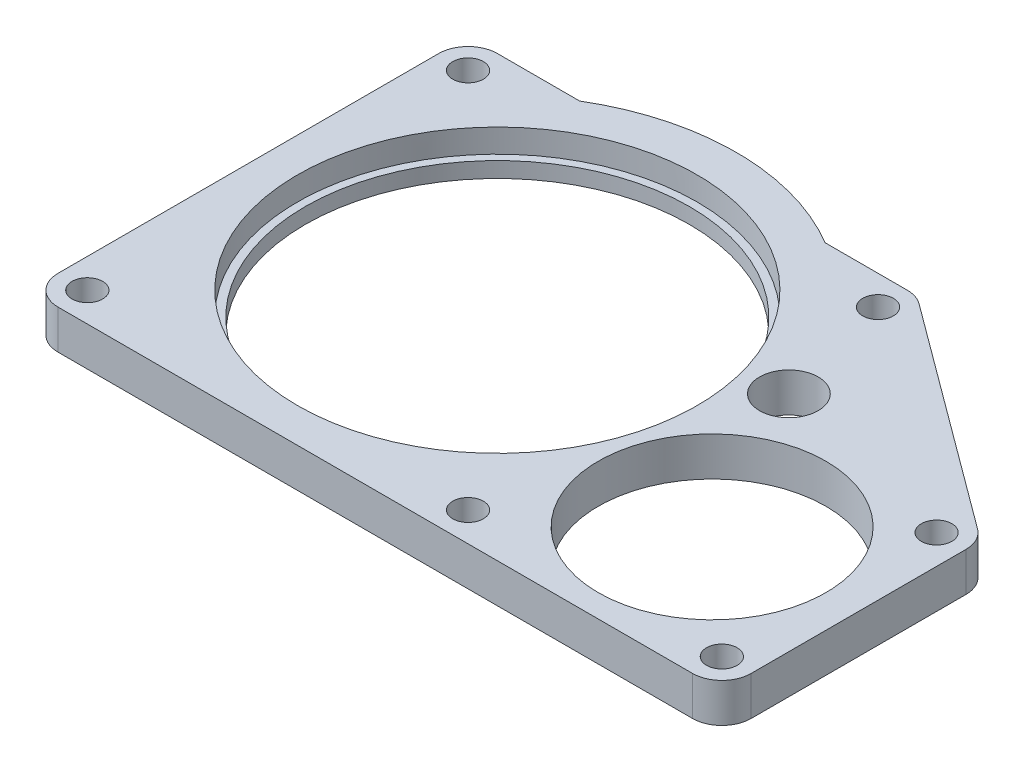
ISO-10303-21;
HEADER;
FILE_DESCRIPTION(('STEP AP214'),'2;1');
FILE_NAME('part.step','',(''),(''),'','','');
FILE_SCHEMA(('AUTOMOTIVE_DESIGN { 1 0 10303 214 1 1 1 1 }'));
ENDSEC;
DATA;
#1=APPLICATION_CONTEXT('core data for automotive mechanical design processes');
#2=APPLICATION_PROTOCOL_DEFINITION('international standard','automotive_design',2000,#1);
#3=PRODUCT_CONTEXT('',#1,'mechanical');
#4=PRODUCT('Part','Part','',(#3));
#5=PRODUCT_RELATED_PRODUCT_CATEGORY('part','',(#4));
#6=PRODUCT_DEFINITION_FORMATION('','',#4);
#7=PRODUCT_DEFINITION_CONTEXT('part definition',#1,'design');
#8=PRODUCT_DEFINITION('design','',#6,#7);
#9=PRODUCT_DEFINITION_SHAPE('','',#8);
#10=(LENGTH_UNIT() NAMED_UNIT(*) SI_UNIT(.MILLI.,.METRE.));
#11=(NAMED_UNIT(*) PLANE_ANGLE_UNIT() SI_UNIT($,.RADIAN.));
#12=(NAMED_UNIT(*) SI_UNIT($,.STERADIAN.) SOLID_ANGLE_UNIT());
#13=UNCERTAINTY_MEASURE_WITH_UNIT(LENGTH_MEASURE(1.E-05),#10,'distance_accuracy_value','');
#14=(GEOMETRIC_REPRESENTATION_CONTEXT(3) GLOBAL_UNCERTAINTY_ASSIGNED_CONTEXT((#13)) GLOBAL_UNIT_ASSIGNED_CONTEXT((#10,
#11,#12)) REPRESENTATION_CONTEXT('',''));
#15=CARTESIAN_POINT('',(0.,0.,0.));
#16=DIRECTION('',(0.,0.,1.));
#17=DIRECTION('',(1.,0.,0.));
#18=AXIS2_PLACEMENT_3D('',#15,#16,#17);
#19=CARTESIAN_POINT('',(0.,21.575,0.));
#20=DIRECTION('',(0.,1.,0.));
#21=DIRECTION('',(0.,0.,1.));
#22=AXIS2_PLACEMENT_3D('',#19,#20,#21);
#23=CYLINDRICAL_SURFACE('',#22,32.5);
#24=CARTESIAN_POINT('',(0.,27.925,0.));
#25=DIRECTION('',(0.,1.,0.));
#26=DIRECTION('',(0.,0.,1.));
#27=AXIS2_PLACEMENT_3D('',#24,#25,#26);
#28=CIRCLE('',#27,32.5);
#29=CARTESIAN_POINT('',(0.,27.925,32.5));
#30=VERTEX_POINT('',#29);
#31=EDGE_CURVE('E161',#30,#30,#28,.T.);
#32=ORIENTED_EDGE('',*,*,#31,.T.);
#33=EDGE_LOOP('',(#32));
#34=FACE_BOUND('',#33,.T.);
#35=CARTESIAN_POINT('',(0.,24.1,0.));
#36=DIRECTION('',(0.,-1.,0.));
#37=DIRECTION('',(0.,0.,-1.));
#38=AXIS2_PLACEMENT_3D('',#35,#36,#37);
#39=CIRCLE('',#38,32.5);
#40=CARTESIAN_POINT('',(0.,24.1,-32.5));
#41=VERTEX_POINT('',#40);
#42=EDGE_CURVE('E11',#41,#41,#39,.F.);
#43=ORIENTED_EDGE('',*,*,#42,.F.);
#44=EDGE_LOOP('',(#43));
#45=FACE_BOUND('',#44,.T.);
#46=ADVANCED_FACE('F33',(#34,#45),#23,.F.);
#47=CARTESIAN_POINT('',(-33.3375,21.575,33.3375));
#48=DIRECTION('',(0.,1.,0.));
#49=DIRECTION('',(0.,0.,1.));
#50=AXIS2_PLACEMENT_3D('',#47,#48,#49);
#51=CYLINDRICAL_SURFACE('',#50,4.76250000000001);
#52=CARTESIAN_POINT('',(-33.3375,27.925,33.3375));
#53=DIRECTION('',(0.,1.,0.));
#54=DIRECTION('',(0.,0.,1.));
#55=AXIS2_PLACEMENT_3D('',#52,#53,#54);
#56=CIRCLE('',#55,4.76250000000001);
#57=CARTESIAN_POINT('',(-38.1,27.925,33.3375));
#58=VERTEX_POINT('',#57);
#59=CARTESIAN_POINT('',(-33.3375,27.925,38.1));
#60=VERTEX_POINT('',#59);
#61=EDGE_CURVE('E157',#58,#60,#56,.T.);
#62=ORIENTED_EDGE('',*,*,#61,.F.);
#63=DIRECTION('',(0.,1.,0.));
#64=VECTOR('',#63,1.);
#65=CARTESIAN_POINT('',(-38.1,21.575,33.3375));
#66=LINE('',#65,#64);
#67=CARTESIAN_POINT('',(-38.1,21.575,33.3375));
#68=VERTEX_POINT('',#67);
#69=EDGE_CURVE('E42',#68,#58,#66,.T.);
#70=ORIENTED_EDGE('',*,*,#69,.F.);
#71=CARTESIAN_POINT('',(-33.3375,21.575,33.3375));
#72=DIRECTION('',(0.,1.,0.));
#73=DIRECTION('',(0.,0.,1.));
#74=AXIS2_PLACEMENT_3D('',#71,#72,#73);
#75=CIRCLE('',#74,4.76250000000001);
#76=CARTESIAN_POINT('',(-33.3375,21.575,38.1));
#77=VERTEX_POINT('',#76);
#78=EDGE_CURVE('E191',#68,#77,#75,.T.);
#79=ORIENTED_EDGE('',*,*,#78,.T.);
#80=DIRECTION('',(0.,1.,0.));
#81=VECTOR('',#80,1.);
#82=CARTESIAN_POINT('',(-33.3375,21.575,38.1));
#83=LINE('',#82,#81);
#84=EDGE_CURVE('E102',#77,#60,#83,.T.);
#85=ORIENTED_EDGE('',*,*,#84,.T.);
#86=EDGE_LOOP('',(#62,#70,#79,#85));
#87=FACE_BOUND('',#86,.T.);
#88=ADVANCED_FACE('F35',(#87),#51,.T.);
#89=CARTESIAN_POINT('',(-38.1,21.575,-28.575));
#90=DIRECTION('',(-1.,0.,0.));
#91=DIRECTION('',(0.,0.,1.));
#92=AXIS2_PLACEMENT_3D('',#89,#90,#91);
#93=PLANE('',#92);
#94=DIRECTION('',(0.,0.,1.));
#95=VECTOR('',#94,1.);
#96=CARTESIAN_POINT('',(-38.1,27.925,-28.575));
#97=LINE('',#96,#95);
#98=CARTESIAN_POINT('',(-38.1,27.925,-28.575));
#99=VERTEX_POINT('',#98);
#100=EDGE_CURVE('E188',#99,#58,#97,.T.);
#101=ORIENTED_EDGE('',*,*,#100,.F.);
#102=DIRECTION('',(0.,1.,0.));
#103=VECTOR('',#102,1.);
#104=CARTESIAN_POINT('',(-38.1,21.575,-28.575));
#105=LINE('',#104,#103);
#106=CARTESIAN_POINT('',(-38.1,21.575,-28.575));
#107=VERTEX_POINT('',#106);
#108=EDGE_CURVE('E90',#107,#99,#105,.T.);
#109=ORIENTED_EDGE('',*,*,#108,.F.);
#110=DIRECTION('',(0.,0.,1.));
#111=VECTOR('',#110,1.);
#112=CARTESIAN_POINT('',(-38.1,21.575,-28.575));
#113=LINE('',#112,#111);
#114=EDGE_CURVE('E147',#107,#68,#113,.T.);
#115=ORIENTED_EDGE('',*,*,#114,.T.);
#116=ORIENTED_EDGE('',*,*,#69,.T.);
#117=EDGE_LOOP('',(#101,#109,#115,#116));
#118=FACE_BOUND('',#117,.T.);
#119=ADVANCED_FACE('F212',(#118),#93,.T.);
#120=CARTESIAN_POINT('',(-33.3375,21.575,-28.575));
#121=DIRECTION('',(0.,1.,0.));
#122=DIRECTION('',(0.,0.,1.));
#123=AXIS2_PLACEMENT_3D('',#120,#121,#122);
#124=CYLINDRICAL_SURFACE('',#123,4.76250000000003);
#125=CARTESIAN_POINT('',(-33.3375,27.925,-28.575));
#126=DIRECTION('',(0.,1.,0.));
#127=DIRECTION('',(0.,0.,-1.));
#128=AXIS2_PLACEMENT_3D('',#125,#126,#127);
#129=CIRCLE('',#128,4.76250000000003);
#130=CARTESIAN_POINT('',(-33.3375,27.925,-33.3375));
#131=VERTEX_POINT('',#130);
#132=EDGE_CURVE('E133',#131,#99,#129,.T.);
#133=ORIENTED_EDGE('',*,*,#132,.F.);
#134=DIRECTION('',(0.,1.,0.));
#135=VECTOR('',#134,1.);
#136=CARTESIAN_POINT('',(-33.3375,21.575,-33.3375));
#137=LINE('',#136,#135);
#138=CARTESIAN_POINT('',(-33.3375,21.575,-33.3375));
#139=VERTEX_POINT('',#138);
#140=EDGE_CURVE('E128',#139,#131,#137,.T.);
#141=ORIENTED_EDGE('',*,*,#140,.F.);
#142=CARTESIAN_POINT('',(-33.3375,21.575,-28.575));
#143=DIRECTION('',(0.,1.,0.));
#144=DIRECTION('',(0.,0.,-1.));
#145=AXIS2_PLACEMENT_3D('',#142,#143,#144);
#146=CIRCLE('',#145,4.76250000000003);
#147=EDGE_CURVE('E131',#139,#107,#146,.T.);
#148=ORIENTED_EDGE('',*,*,#147,.T.);
#149=ORIENTED_EDGE('',*,*,#108,.T.);
#150=EDGE_LOOP('',(#133,#141,#148,#149));
#151=FACE_BOUND('',#150,.T.);
#152=ADVANCED_FACE('F130',(#151),#124,.T.);
#153=CARTESIAN_POINT('',(-33.3375,21.575,-33.3375));
#154=DIRECTION('',(0.,0.,-1.));
#155=DIRECTION('',(-1.,0.,0.));
#156=AXIS2_PLACEMENT_3D('',#153,#154,#155);
#157=PLANE('',#156);
#158=DIRECTION('',(-1.,0.,0.));
#159=VECTOR('',#158,1.);
#160=CARTESIAN_POINT('',(-33.3375,27.925,-33.3375));
#161=LINE('',#160,#159);
#162=CARTESIAN_POINT('',(-19.9482729515615,27.925,-33.3375));
#163=VERTEX_POINT('',#162);
#164=EDGE_CURVE('E185',#163,#131,#161,.T.);
#165=ORIENTED_EDGE('',*,*,#164,.F.);
#166=DIRECTION('',(0.,1.,0.));
#167=VECTOR('',#166,1.);
#168=CARTESIAN_POINT('',(-19.9482729515615,21.575,-33.3375));
#169=LINE('',#168,#167);
#170=CARTESIAN_POINT('',(-19.9482729515615,21.575,-33.3375));
#171=VERTEX_POINT('',#170);
#172=EDGE_CURVE('E138',#171,#163,#169,.T.);
#173=ORIENTED_EDGE('',*,*,#172,.F.);
#174=DIRECTION('',(-1.,0.,0.));
#175=VECTOR('',#174,1.);
#176=CARTESIAN_POINT('',(-33.3375,21.575,-33.3375));
#177=LINE('',#176,#175);
#178=EDGE_CURVE('E145',#171,#139,#177,.T.);
#179=ORIENTED_EDGE('',*,*,#178,.T.);
#180=ORIENTED_EDGE('',*,*,#140,.T.);
#181=EDGE_LOOP('',(#165,#173,#179,#180));
#182=FACE_BOUND('',#181,.T.);
#183=ADVANCED_FACE('F149',(#182),#157,.T.);
#184=CARTESIAN_POINT('',(0.,21.575,0.));
#185=DIRECTION('',(0.,1.,0.));
#186=DIRECTION('',(0.,0.,1.));
#187=AXIS2_PLACEMENT_3D('',#184,#185,#186);
#188=CYLINDRICAL_SURFACE('',#187,38.85);
#189=CARTESIAN_POINT('',(0.,27.925,0.));
#190=DIRECTION('',(0.,1.,0.));
#191=DIRECTION('',(0.,0.,-1.));
#192=AXIS2_PLACEMENT_3D('',#189,#190,#191);
#193=CIRCLE('',#192,38.85);
#194=CARTESIAN_POINT('',(19.9482729515615,27.925,-33.3375));
#195=VERTEX_POINT('',#194);
#196=EDGE_CURVE('E182',#195,#163,#193,.T.);
#197=ORIENTED_EDGE('',*,*,#196,.F.);
#198=DIRECTION('',(0.,1.,0.));
#199=VECTOR('',#198,1.);
#200=CARTESIAN_POINT('',(19.9482729515615,21.575,-33.3375));
#201=LINE('',#200,#199);
#202=CARTESIAN_POINT('',(19.9482729515615,21.575,-33.3375));
#203=VERTEX_POINT('',#202);
#204=EDGE_CURVE('E195',#203,#195,#201,.T.);
#205=ORIENTED_EDGE('',*,*,#204,.F.);
#206=CARTESIAN_POINT('',(0.,21.575,0.));
#207=DIRECTION('',(0.,1.,0.));
#208=DIRECTION('',(0.,0.,-1.));
#209=AXIS2_PLACEMENT_3D('',#206,#207,#208);
#210=CIRCLE('',#209,38.85);
#211=EDGE_CURVE('E150',#203,#171,#210,.T.);
#212=ORIENTED_EDGE('',*,*,#211,.T.);
#213=ORIENTED_EDGE('',*,*,#172,.T.);
#214=EDGE_LOOP('',(#197,#205,#212,#213));
#215=FACE_BOUND('',#214,.T.);
#216=ADVANCED_FACE('F323',(#215),#188,.T.);
#217=CARTESIAN_POINT('',(19.9482729515615,21.575,-33.3375));
#218=DIRECTION('',(0.,0.,-1.));
#219=DIRECTION('',(-1.,0.,0.));
#220=AXIS2_PLACEMENT_3D('',#217,#218,#219);
#221=PLANE('',#220);
#222=DIRECTION('',(-1.,0.,0.));
#223=VECTOR('',#222,1.);
#224=CARTESIAN_POINT('',(19.9482729515615,27.925,-33.3375));
#225=LINE('',#224,#223);
#226=CARTESIAN_POINT('',(33.3375,27.925,-33.3375));
#227=VERTEX_POINT('',#226);
#228=EDGE_CURVE('E179',#227,#195,#225,.T.);
#229=ORIENTED_EDGE('',*,*,#228,.F.);
#230=DIRECTION('',(0.,1.,0.));
#231=VECTOR('',#230,1.);
#232=CARTESIAN_POINT('',(33.3375,21.575,-33.3375));
#233=LINE('',#232,#231);
#234=CARTESIAN_POINT('',(33.3375,21.575,-33.3375));
#235=VERTEX_POINT('',#234);
#236=EDGE_CURVE('E197',#235,#227,#233,.T.);
#237=ORIENTED_EDGE('',*,*,#236,.F.);
#238=DIRECTION('',(-1.,0.,0.));
#239=VECTOR('',#238,1.);
#240=CARTESIAN_POINT('',(19.9482729515615,21.575,-33.3375));
#241=LINE('',#240,#239);
#242=EDGE_CURVE('E152',#235,#203,#241,.T.);
#243=ORIENTED_EDGE('',*,*,#242,.T.);
#244=ORIENTED_EDGE('',*,*,#204,.T.);
#245=EDGE_LOOP('',(#229,#237,#243,#244));
#246=FACE_BOUND('',#245,.T.);
#247=ADVANCED_FACE('F301',(#246),#221,.T.);
#248=CARTESIAN_POINT('',(33.3375,21.575,-28.575));
#249=DIRECTION('',(0.,1.,0.));
#250=DIRECTION('',(0.,0.,1.));
#251=AXIS2_PLACEMENT_3D('',#248,#249,#250);
#252=CYLINDRICAL_SURFACE('',#251,4.7625);
#253=CARTESIAN_POINT('',(33.3375,27.925,-28.575));
#254=DIRECTION('',(0.,1.,0.));
#255=DIRECTION('',(0.,0.,-1.));
#256=AXIS2_PLACEMENT_3D('',#253,#254,#255);
#257=CIRCLE('',#256,4.7625);
#258=CARTESIAN_POINT('',(36.1682874284116,27.925,-32.4048888737334));
#259=VERTEX_POINT('',#258);
#260=EDGE_CURVE('E176',#259,#227,#257,.T.);
#261=ORIENTED_EDGE('',*,*,#260,.F.);
#262=DIRECTION('',(0.,1.,0.));
#263=VECTOR('',#262,1.);
#264=CARTESIAN_POINT('',(36.1682874284116,21.575,-32.4048888737334));
#265=LINE('',#264,#263);
#266=CARTESIAN_POINT('',(36.1682874284116,21.575,-32.4048888737334));
#267=VERTEX_POINT('',#266);
#268=EDGE_CURVE('E199',#267,#259,#265,.T.);
#269=ORIENTED_EDGE('',*,*,#268,.F.);
#270=CARTESIAN_POINT('',(33.3375,21.575,-28.575));
#271=DIRECTION('',(0.,1.,0.));
#272=DIRECTION('',(0.,0.,-1.));
#273=AXIS2_PLACEMENT_3D('',#270,#271,#272);
#274=CIRCLE('',#273,4.7625);
#275=EDGE_CURVE('E295',#267,#235,#274,.T.);
#276=ORIENTED_EDGE('',*,*,#275,.T.);
#277=ORIENTED_EDGE('',*,*,#236,.T.);
#278=EDGE_LOOP('',(#261,#269,#276,#277));
#279=FACE_BOUND('',#278,.T.);
#280=ADVANCED_FACE('F307',(#279),#252,.T.);
#281=CARTESIAN_POINT('',(36.1682874284116,21.575,-32.4048888737334));
#282=DIRECTION('',(0.594391061083806,0.,-0.804176141466325));
#283=DIRECTION('',(-0.804176141466325,0.,-0.594391061083806));
#284=AXIS2_PLACEMENT_3D('',#281,#282,#283);
#285=PLANE('',#284);
#286=DIRECTION('',(-0.804176141466325,0.,-0.594391061083806));
#287=VECTOR('',#286,1.);
#288=CARTESIAN_POINT('',(36.1682874284116,27.925,-32.4048888737334));
#289=LINE('',#288,#287);
#290=CARTESIAN_POINT('',(72.6807874284116,27.925,-5.41738887373337));
#291=VERTEX_POINT('',#290);
#292=EDGE_CURVE('E173',#291,#259,#289,.T.);
#293=ORIENTED_EDGE('',*,*,#292,.F.);
#294=DIRECTION('',(0.,1.,0.));
#295=VECTOR('',#294,1.);
#296=CARTESIAN_POINT('',(72.6807874284116,21.575,-5.41738887373337));
#297=LINE('',#296,#295);
#298=CARTESIAN_POINT('',(72.6807874284116,21.575,-5.41738887373337));
#299=VERTEX_POINT('',#298);
#300=EDGE_CURVE('E201',#299,#291,#297,.T.);
#301=ORIENTED_EDGE('',*,*,#300,.F.);
#302=DIRECTION('',(-0.804176141466325,0.,-0.594391061083806));
#303=VECTOR('',#302,1.);
#304=CARTESIAN_POINT('',(36.1682874284116,21.575,-32.4048888737334));
#305=LINE('',#304,#303);
#306=EDGE_CURVE('E292',#299,#267,#305,.T.);
#307=ORIENTED_EDGE('',*,*,#306,.T.);
#308=ORIENTED_EDGE('',*,*,#268,.T.);
#309=EDGE_LOOP('',(#293,#301,#307,#308));
#310=FACE_BOUND('',#309,.T.);
#311=ADVANCED_FACE('F310',(#310),#285,.T.);
#312=CARTESIAN_POINT('',(69.85,21.575,-1.5875));
#313=DIRECTION('',(0.,1.,0.));
#314=DIRECTION('',(0.,0.,1.));
#315=AXIS2_PLACEMENT_3D('',#312,#313,#314);
#316=CYLINDRICAL_SURFACE('',#315,4.7625);
#317=CARTESIAN_POINT('',(69.85,27.925,-1.5875));
#318=DIRECTION('',(0.,1.,0.));
#319=DIRECTION('',(0.,0.,1.));
#320=AXIS2_PLACEMENT_3D('',#317,#318,#319);
#321=CIRCLE('',#320,4.7625);
#322=CARTESIAN_POINT('',(74.6125,27.925,-1.5875));
#323=VERTEX_POINT('',#322);
#324=EDGE_CURVE('E170',#323,#291,#321,.T.);
#325=ORIENTED_EDGE('',*,*,#324,.F.);
#326=DIRECTION('',(0.,1.,0.));
#327=VECTOR('',#326,1.);
#328=CARTESIAN_POINT('',(74.6125,21.575,-1.5875));
#329=LINE('',#328,#327);
#330=CARTESIAN_POINT('',(74.6125,21.575,-1.5875));
#331=VERTEX_POINT('',#330);
#332=EDGE_CURVE('E203',#331,#323,#329,.T.);
#333=ORIENTED_EDGE('',*,*,#332,.F.);
#334=CARTESIAN_POINT('',(69.85,21.575,-1.5875));
#335=DIRECTION('',(0.,1.,0.));
#336=DIRECTION('',(0.,0.,1.));
#337=AXIS2_PLACEMENT_3D('',#334,#335,#336);
#338=CIRCLE('',#337,4.7625);
#339=EDGE_CURVE('E289',#331,#299,#338,.T.);
#340=ORIENTED_EDGE('',*,*,#339,.T.);
#341=ORIENTED_EDGE('',*,*,#300,.T.);
#342=EDGE_LOOP('',(#325,#333,#340,#341));
#343=FACE_BOUND('',#342,.T.);
#344=ADVANCED_FACE('F315',(#343),#316,.T.);
#345=CARTESIAN_POINT('',(74.6125,21.575,-1.5875));
#346=DIRECTION('',(1.,0.,0.));
#347=DIRECTION('',(0.,0.,-1.));
#348=AXIS2_PLACEMENT_3D('',#345,#346,#347);
#349=PLANE('',#348);
#350=DIRECTION('',(0.,0.,-1.));
#351=VECTOR('',#350,1.);
#352=CARTESIAN_POINT('',(74.6125,27.925,-1.5875));
#353=LINE('',#352,#351);
#354=CARTESIAN_POINT('',(74.6125,27.925,33.3375));
#355=VERTEX_POINT('',#354);
#356=EDGE_CURVE('E167',#355,#323,#353,.T.);
#357=ORIENTED_EDGE('',*,*,#356,.F.);
#358=DIRECTION('',(0.,1.,0.));
#359=VECTOR('',#358,1.);
#360=CARTESIAN_POINT('',(74.6125,21.575,33.3375));
#361=LINE('',#360,#359);
#362=CARTESIAN_POINT('',(74.6125,21.575,33.3375));
#363=VERTEX_POINT('',#362);
#364=EDGE_CURVE('E205',#363,#355,#361,.T.);
#365=ORIENTED_EDGE('',*,*,#364,.F.);
#366=DIRECTION('',(0.,0.,-1.));
#367=VECTOR('',#366,1.);
#368=CARTESIAN_POINT('',(74.6125,21.575,-1.5875));
#369=LINE('',#368,#367);
#370=EDGE_CURVE('E286',#363,#331,#369,.T.);
#371=ORIENTED_EDGE('',*,*,#370,.T.);
#372=ORIENTED_EDGE('',*,*,#332,.T.);
#373=EDGE_LOOP('',(#357,#365,#371,#372));
#374=FACE_BOUND('',#373,.T.);
#375=ADVANCED_FACE('F318',(#374),#349,.T.);
#376=CARTESIAN_POINT('',(69.85,21.575,33.3375));
#377=DIRECTION('',(0.,1.,0.));
#378=DIRECTION('',(0.,0.,1.));
#379=AXIS2_PLACEMENT_3D('',#376,#377,#378);
#380=CYLINDRICAL_SURFACE('',#379,4.76250000000001);
#381=CARTESIAN_POINT('',(69.85,27.925,33.3375));
#382=DIRECTION('',(0.,1.,0.));
#383=DIRECTION('',(0.,0.,1.));
#384=AXIS2_PLACEMENT_3D('',#381,#382,#383);
#385=CIRCLE('',#384,4.76250000000001);
#386=CARTESIAN_POINT('',(69.85,27.925,38.1));
#387=VERTEX_POINT('',#386);
#388=EDGE_CURVE('E164',#387,#355,#385,.T.);
#389=ORIENTED_EDGE('',*,*,#388,.F.);
#390=DIRECTION('',(0.,1.,0.));
#391=VECTOR('',#390,1.);
#392=CARTESIAN_POINT('',(69.85,21.575,38.1));
#393=LINE('',#392,#391);
#394=CARTESIAN_POINT('',(69.85,21.575,38.1));
#395=VERTEX_POINT('',#394);
#396=EDGE_CURVE('E207',#395,#387,#393,.T.);
#397=ORIENTED_EDGE('',*,*,#396,.F.);
#398=CARTESIAN_POINT('',(69.85,21.575,33.3375));
#399=DIRECTION('',(0.,1.,0.));
#400=DIRECTION('',(0.,0.,1.));
#401=AXIS2_PLACEMENT_3D('',#398,#399,#400);
#402=CIRCLE('',#401,4.76250000000001);
#403=EDGE_CURVE('E283',#395,#363,#402,.T.);
#404=ORIENTED_EDGE('',*,*,#403,.T.);
#405=ORIENTED_EDGE('',*,*,#364,.T.);
#406=EDGE_LOOP('',(#389,#397,#404,#405));
#407=FACE_BOUND('',#406,.T.);
#408=ADVANCED_FACE('F321',(#407),#380,.T.);
#409=CARTESIAN_POINT('',(-33.3375,21.575,38.1));
#410=DIRECTION('',(0.,0.,1.));
#411=DIRECTION('',(1.,0.,0.));
#412=AXIS2_PLACEMENT_3D('',#409,#410,#411);
#413=PLANE('',#412);
#414=DIRECTION('',(1.,0.,0.));
#415=VECTOR('',#414,1.);
#416=CARTESIAN_POINT('',(-33.3375,27.925,38.1));
#417=LINE('',#416,#415);
#418=EDGE_CURVE('E160',#60,#387,#417,.T.);
#419=ORIENTED_EDGE('',*,*,#418,.F.);
#420=ORIENTED_EDGE('',*,*,#84,.F.);
#421=DIRECTION('',(1.,0.,0.));
#422=VECTOR('',#421,1.);
#423=CARTESIAN_POINT('',(-33.3375,21.575,38.1));
#424=LINE('',#423,#422);
#425=EDGE_CURVE('E281',#77,#395,#424,.T.);
#426=ORIENTED_EDGE('',*,*,#425,.T.);
#427=ORIENTED_EDGE('',*,*,#396,.T.);
#428=EDGE_LOOP('',(#419,#420,#426,#427));
#429=FACE_BOUND('',#428,.T.);
#430=ADVANCED_FACE('F208',(#429),#413,.T.);
#431=CARTESIAN_POINT('',(-33.3375,21.575,33.3375));
#432=DIRECTION('',(0.,1.,0.));
#433=DIRECTION('',(0.,0.,1.));
#434=AXIS2_PLACEMENT_3D('',#431,#432,#433);
#435=PLANE('',#434);
#436=CARTESIAN_POINT('',(33.3375,21.575,-28.575));
#437=DIRECTION('',(0.,1.,0.));
#438=DIRECTION('',(0.,0.,1.));
#439=AXIS2_PLACEMENT_3D('',#436,#437,#438);
#440=CIRCLE('',#439,2.4892);
#441=CARTESIAN_POINT('',(33.3375,21.575,-26.0858));
#442=VERTEX_POINT('',#441);
#443=EDGE_CURVE('E467',#442,#442,#440,.T.);
#444=ORIENTED_EDGE('',*,*,#443,.T.);
#445=EDGE_LOOP('',(#444));
#446=FACE_BOUND('',#445,.T.);
#447=CARTESIAN_POINT('',(69.85,21.575,-1.5875));
#448=DIRECTION('',(0.,1.,0.));
#449=DIRECTION('',(0.,0.,1.));
#450=AXIS2_PLACEMENT_3D('',#447,#448,#449);
#451=CIRCLE('',#450,2.4892);
#452=CARTESIAN_POINT('',(69.85,21.575,0.901700000000004));
#453=VERTEX_POINT('',#452);
#454=EDGE_CURVE('E471',#453,#453,#451,.T.);
#455=ORIENTED_EDGE('',*,*,#454,.T.);
#456=EDGE_LOOP('',(#455));
#457=FACE_BOUND('',#456,.T.);
#458=CARTESIAN_POINT('',(69.85,21.575,33.3375));
#459=DIRECTION('',(0.,1.,0.));
#460=DIRECTION('',(0.,0.,1.));
#461=AXIS2_PLACEMENT_3D('',#458,#459,#460);
#462=CIRCLE('',#461,2.4892);
#463=CARTESIAN_POINT('',(69.85,21.575,35.8267));
#464=VERTEX_POINT('',#463);
#465=EDGE_CURVE('E475',#464,#464,#462,.T.);
#466=ORIENTED_EDGE('',*,*,#465,.T.);
#467=EDGE_LOOP('',(#466));
#468=FACE_BOUND('',#467,.T.);
#469=CARTESIAN_POINT('',(38.3007293409388,21.575,-9.11323389100423));
#470=DIRECTION('',(0.,1.,0.));
#471=DIRECTION('',(0.,0.,1.));
#472=AXIS2_PLACEMENT_3D('',#469,#470,#471);
#473=CIRCLE('',#472,4.7625);
#474=CARTESIAN_POINT('',(38.3007293409388,21.575,-4.35073389100423));
#475=VERTEX_POINT('',#474);
#476=EDGE_CURVE('E479',#475,#475,#473,.T.);
#477=ORIENTED_EDGE('',*,*,#476,.T.);
#478=EDGE_LOOP('',(#477));
#479=FACE_BOUND('',#478,.T.);
#480=CARTESIAN_POINT('',(50.8,21.575,15.875));
#481=DIRECTION('',(0.,1.,0.));
#482=DIRECTION('',(0.,0.,1.));
#483=AXIS2_PLACEMENT_3D('',#480,#481,#482);
#484=CIRCLE('',#483,18.5166);
#485=CARTESIAN_POINT('',(50.8,21.575,34.3916));
#486=VERTEX_POINT('',#485);
#487=EDGE_CURVE('E483',#486,#486,#484,.T.);
#488=ORIENTED_EDGE('',*,*,#487,.T.);
#489=EDGE_LOOP('',(#488));
#490=FACE_BOUND('',#489,.T.);
#491=CARTESIAN_POINT('',(28.575,21.575,33.3375));
#492=DIRECTION('',(0.,1.,0.));
#493=DIRECTION('',(0.,0.,1.));
#494=AXIS2_PLACEMENT_3D('',#491,#492,#493);
#495=CIRCLE('',#494,2.4892);
#496=CARTESIAN_POINT('',(28.575,21.575,35.8267));
#497=VERTEX_POINT('',#496);
#498=EDGE_CURVE('E487',#497,#497,#495,.T.);
#499=ORIENTED_EDGE('',*,*,#498,.T.);
#500=EDGE_LOOP('',(#499));
#501=FACE_BOUND('',#500,.T.);
#502=CARTESIAN_POINT('',(-33.3375,21.575,33.3375));
#503=DIRECTION('',(0.,1.,0.));
#504=DIRECTION('',(0.,0.,1.));
#505=AXIS2_PLACEMENT_3D('',#502,#503,#504);
#506=CIRCLE('',#505,2.4892);
#507=CARTESIAN_POINT('',(-33.3375,21.575,35.8267));
#508=VERTEX_POINT('',#507);
#509=EDGE_CURVE('E491',#508,#508,#506,.T.);
#510=ORIENTED_EDGE('',*,*,#509,.T.);
#511=EDGE_LOOP('',(#510));
#512=FACE_BOUND('',#511,.T.);
#513=CARTESIAN_POINT('',(-33.3375,21.575,-28.575));
#514=DIRECTION('',(0.,1.,0.));
#515=DIRECTION('',(0.,0.,1.));
#516=AXIS2_PLACEMENT_3D('',#513,#514,#515);
#517=CIRCLE('',#516,2.4892);
#518=CARTESIAN_POINT('',(-33.3375,21.575,-26.0858));
#519=VERTEX_POINT('',#518);
#520=EDGE_CURVE('E274',#519,#519,#517,.T.);
#521=ORIENTED_EDGE('',*,*,#520,.T.);
#522=EDGE_LOOP('',(#521));
#523=FACE_BOUND('',#522,.T.);
#524=ORIENTED_EDGE('',*,*,#78,.F.);
#525=ORIENTED_EDGE('',*,*,#114,.F.);
#526=ORIENTED_EDGE('',*,*,#147,.F.);
#527=ORIENTED_EDGE('',*,*,#178,.F.);
#528=ORIENTED_EDGE('',*,*,#211,.F.);
#529=ORIENTED_EDGE('',*,*,#242,.F.);
#530=ORIENTED_EDGE('',*,*,#275,.F.);
#531=ORIENTED_EDGE('',*,*,#306,.F.);
#532=ORIENTED_EDGE('',*,*,#339,.F.);
#533=ORIENTED_EDGE('',*,*,#370,.F.);
#534=ORIENTED_EDGE('',*,*,#403,.F.);
#535=ORIENTED_EDGE('',*,*,#425,.F.);
#536=EDGE_LOOP('',(#524,#525,#526,#527,#528,#529,#530,#531,#532,#533,#534,#535));
#537=FACE_BOUND('',#536,.T.);
#538=CARTESIAN_POINT('',(0.,21.575,0.));
#539=DIRECTION('',(0.,-1.,0.));
#540=DIRECTION('',(0.,0.,-1.));
#541=AXIS2_PLACEMENT_3D('',#538,#539,#540);
#542=CIRCLE('',#541,31.23);
#543=CARTESIAN_POINT('',(0.,21.575,-31.23));
#544=VERTEX_POINT('',#543);
#545=EDGE_CURVE('E463',#544,#544,#542,.T.);
#546=ORIENTED_EDGE('',*,*,#545,.F.);
#547=EDGE_LOOP('',(#546));
#548=FACE_BOUND('',#547,.T.);
#549=ADVANCED_FACE('F142',(#446,#457,#468,#479,#490,#501,#512,#523,#537,#548),#435,.F.);
#550=CARTESIAN_POINT('',(-33.3375,27.925,33.3375));
#551=DIRECTION('',(0.,1.,0.));
#552=DIRECTION('',(0.,0.,1.));
#553=AXIS2_PLACEMENT_3D('',#550,#551,#552);
#554=PLANE('',#553);
#555=CARTESIAN_POINT('',(33.3375,27.925,-28.575));
#556=DIRECTION('',(0.,1.,0.));
#557=DIRECTION('',(0.,0.,1.));
#558=AXIS2_PLACEMENT_3D('',#555,#556,#557);
#559=CIRCLE('',#558,2.4892);
#560=CARTESIAN_POINT('',(33.3375,27.925,-26.0858));
#561=VERTEX_POINT('',#560);
#562=EDGE_CURVE('E244',#561,#561,#559,.T.);
#563=ORIENTED_EDGE('',*,*,#562,.F.);
#564=EDGE_LOOP('',(#563));
#565=FACE_BOUND('',#564,.T.);
#566=CARTESIAN_POINT('',(69.85,27.925,-1.5875));
#567=DIRECTION('',(0.,1.,0.));
#568=DIRECTION('',(0.,0.,1.));
#569=AXIS2_PLACEMENT_3D('',#566,#567,#568);
#570=CIRCLE('',#569,2.4892);
#571=CARTESIAN_POINT('',(69.85,27.925,0.901700000000004));
#572=VERTEX_POINT('',#571);
#573=EDGE_CURVE('E248',#572,#572,#570,.T.);
#574=ORIENTED_EDGE('',*,*,#573,.F.);
#575=EDGE_LOOP('',(#574));
#576=FACE_BOUND('',#575,.T.);
#577=CARTESIAN_POINT('',(69.85,27.925,33.3375));
#578=DIRECTION('',(0.,1.,0.));
#579=DIRECTION('',(0.,0.,1.));
#580=AXIS2_PLACEMENT_3D('',#577,#578,#579);
#581=CIRCLE('',#580,2.4892);
#582=CARTESIAN_POINT('',(69.85,27.925,35.8267));
#583=VERTEX_POINT('',#582);
#584=EDGE_CURVE('E252',#583,#583,#581,.T.);
#585=ORIENTED_EDGE('',*,*,#584,.F.);
#586=EDGE_LOOP('',(#585));
#587=FACE_BOUND('',#586,.T.);
#588=CARTESIAN_POINT('',(38.3007293409388,27.925,-9.11323389100423));
#589=DIRECTION('',(0.,1.,0.));
#590=DIRECTION('',(0.,0.,1.));
#591=AXIS2_PLACEMENT_3D('',#588,#589,#590);
#592=CIRCLE('',#591,4.7625);
#593=CARTESIAN_POINT('',(38.3007293409388,27.925,-4.35073389100423));
#594=VERTEX_POINT('',#593);
#595=EDGE_CURVE('E256',#594,#594,#592,.T.);
#596=ORIENTED_EDGE('',*,*,#595,.F.);
#597=EDGE_LOOP('',(#596));
#598=FACE_BOUND('',#597,.T.);
#599=CARTESIAN_POINT('',(50.8,27.925,15.875));
#600=DIRECTION('',(0.,1.,0.));
#601=DIRECTION('',(0.,0.,1.));
#602=AXIS2_PLACEMENT_3D('',#599,#600,#601);
#603=CIRCLE('',#602,18.5166);
#604=CARTESIAN_POINT('',(50.8,27.925,34.3916));
#605=VERTEX_POINT('',#604);
#606=EDGE_CURVE('E260',#605,#605,#603,.T.);
#607=ORIENTED_EDGE('',*,*,#606,.F.);
#608=EDGE_LOOP('',(#607));
#609=FACE_BOUND('',#608,.T.);
#610=CARTESIAN_POINT('',(28.575,27.925,33.3375));
#611=DIRECTION('',(0.,1.,0.));
#612=DIRECTION('',(0.,0.,1.));
#613=AXIS2_PLACEMENT_3D('',#610,#611,#612);
#614=CIRCLE('',#613,2.4892);
#615=CARTESIAN_POINT('',(28.575,27.925,35.8267));
#616=VERTEX_POINT('',#615);
#617=EDGE_CURVE('E264',#616,#616,#614,.T.);
#618=ORIENTED_EDGE('',*,*,#617,.F.);
#619=EDGE_LOOP('',(#618));
#620=FACE_BOUND('',#619,.T.);
#621=CARTESIAN_POINT('',(-33.3375,27.925,33.3375));
#622=DIRECTION('',(0.,1.,0.));
#623=DIRECTION('',(0.,0.,1.));
#624=AXIS2_PLACEMENT_3D('',#621,#622,#623);
#625=CIRCLE('',#624,2.4892);
#626=CARTESIAN_POINT('',(-33.3375,27.925,35.8267));
#627=VERTEX_POINT('',#626);
#628=EDGE_CURVE('E268',#627,#627,#625,.T.);
#629=ORIENTED_EDGE('',*,*,#628,.F.);
#630=EDGE_LOOP('',(#629));
#631=FACE_BOUND('',#630,.T.);
#632=CARTESIAN_POINT('',(-33.3375,27.925,-28.575));
#633=DIRECTION('',(0.,1.,0.));
#634=DIRECTION('',(0.,0.,1.));
#635=AXIS2_PLACEMENT_3D('',#632,#633,#634);
#636=CIRCLE('',#635,2.4892);
#637=CARTESIAN_POINT('',(-33.3375,27.925,-26.0858));
#638=VERTEX_POINT('',#637);
#639=EDGE_CURVE('E272',#638,#638,#636,.T.);
#640=ORIENTED_EDGE('',*,*,#639,.F.);
#641=EDGE_LOOP('',(#640));
#642=FACE_BOUND('',#641,.T.);
#643=ORIENTED_EDGE('',*,*,#31,.F.);
#644=EDGE_LOOP('',(#643));
#645=FACE_BOUND('',#644,.T.);
#646=ORIENTED_EDGE('',*,*,#61,.T.);
#647=ORIENTED_EDGE('',*,*,#418,.T.);
#648=ORIENTED_EDGE('',*,*,#388,.T.);
#649=ORIENTED_EDGE('',*,*,#356,.T.);
#650=ORIENTED_EDGE('',*,*,#324,.T.);
#651=ORIENTED_EDGE('',*,*,#292,.T.);
#652=ORIENTED_EDGE('',*,*,#260,.T.);
#653=ORIENTED_EDGE('',*,*,#228,.T.);
#654=ORIENTED_EDGE('',*,*,#196,.T.);
#655=ORIENTED_EDGE('',*,*,#164,.T.);
#656=ORIENTED_EDGE('',*,*,#132,.T.);
#657=ORIENTED_EDGE('',*,*,#100,.T.);
#658=EDGE_LOOP('',(#646,#647,#648,#649,#650,#651,#652,#653,#654,#655,#656,#657));
#659=FACE_BOUND('',#658,.T.);
#660=ADVANCED_FACE('F211',(#565,#576,#587,#598,#609,#620,#631,#642,#645,#659),#554,.T.);
#661=CARTESIAN_POINT('',(-33.3375,21.575,-28.575));
#662=DIRECTION('',(0.,1.,0.));
#663=DIRECTION('',(0.,0.,1.));
#664=AXIS2_PLACEMENT_3D('',#661,#662,#663);
#665=CYLINDRICAL_SURFACE('',#664,2.4892);
#666=ORIENTED_EDGE('',*,*,#520,.F.);
#667=EDGE_LOOP('',(#666));
#668=FACE_BOUND('',#667,.T.);
#669=ORIENTED_EDGE('',*,*,#639,.T.);
#670=EDGE_LOOP('',(#669));
#671=FACE_BOUND('',#670,.T.);
#672=ADVANCED_FACE('F230',(#668,#671),#665,.F.);
#673=CARTESIAN_POINT('',(-33.3375,21.575,33.3375));
#674=DIRECTION('',(0.,1.,0.));
#675=DIRECTION('',(0.,0.,1.));
#676=AXIS2_PLACEMENT_3D('',#673,#674,#675);
#677=CYLINDRICAL_SURFACE('',#676,2.4892);
#678=ORIENTED_EDGE('',*,*,#509,.F.);
#679=EDGE_LOOP('',(#678));
#680=FACE_BOUND('',#679,.T.);
#681=ORIENTED_EDGE('',*,*,#628,.T.);
#682=EDGE_LOOP('',(#681));
#683=FACE_BOUND('',#682,.T.);
#684=ADVANCED_FACE('F239',(#680,#683),#677,.F.);
#685=CARTESIAN_POINT('',(28.575,21.575,33.3375));
#686=DIRECTION('',(0.,1.,0.));
#687=DIRECTION('',(0.,0.,1.));
#688=AXIS2_PLACEMENT_3D('',#685,#686,#687);
#689=CYLINDRICAL_SURFACE('',#688,2.4892);
#690=ORIENTED_EDGE('',*,*,#498,.F.);
#691=EDGE_LOOP('',(#690));
#692=FACE_BOUND('',#691,.T.);
#693=ORIENTED_EDGE('',*,*,#617,.T.);
#694=EDGE_LOOP('',(#693));
#695=FACE_BOUND('',#694,.T.);
#696=ADVANCED_FACE('F375',(#692,#695),#689,.F.);
#697=CARTESIAN_POINT('',(50.8,21.575,15.875));
#698=DIRECTION('',(0.,1.,0.));
#699=DIRECTION('',(0.,0.,1.));
#700=AXIS2_PLACEMENT_3D('',#697,#698,#699);
#701=CYLINDRICAL_SURFACE('',#700,18.5166);
#702=ORIENTED_EDGE('',*,*,#487,.F.);
#703=EDGE_LOOP('',(#702));
#704=FACE_BOUND('',#703,.T.);
#705=ORIENTED_EDGE('',*,*,#606,.T.);
#706=EDGE_LOOP('',(#705));
#707=FACE_BOUND('',#706,.T.);
#708=ADVANCED_FACE('F384',(#704,#707),#701,.F.);
#709=CARTESIAN_POINT('',(38.3007293409388,21.575,-9.11323389100423));
#710=DIRECTION('',(0.,1.,0.));
#711=DIRECTION('',(0.,0.,1.));
#712=AXIS2_PLACEMENT_3D('',#709,#710,#711);
#713=CYLINDRICAL_SURFACE('',#712,4.7625);
#714=ORIENTED_EDGE('',*,*,#476,.F.);
#715=EDGE_LOOP('',(#714));
#716=FACE_BOUND('',#715,.T.);
#717=ORIENTED_EDGE('',*,*,#595,.T.);
#718=EDGE_LOOP('',(#717));
#719=FACE_BOUND('',#718,.T.);
#720=ADVANCED_FACE('F394',(#716,#719),#713,.F.);
#721=CARTESIAN_POINT('',(69.85,21.575,33.3375));
#722=DIRECTION('',(0.,1.,0.));
#723=DIRECTION('',(0.,0.,1.));
#724=AXIS2_PLACEMENT_3D('',#721,#722,#723);
#725=CYLINDRICAL_SURFACE('',#724,2.4892);
#726=ORIENTED_EDGE('',*,*,#465,.F.);
#727=EDGE_LOOP('',(#726));
#728=FACE_BOUND('',#727,.T.);
#729=ORIENTED_EDGE('',*,*,#584,.T.);
#730=EDGE_LOOP('',(#729));
#731=FACE_BOUND('',#730,.T.);
#732=ADVANCED_FACE('F404',(#728,#731),#725,.F.);
#733=CARTESIAN_POINT('',(69.85,21.575,-1.5875));
#734=DIRECTION('',(0.,1.,0.));
#735=DIRECTION('',(0.,0.,1.));
#736=AXIS2_PLACEMENT_3D('',#733,#734,#735);
#737=CYLINDRICAL_SURFACE('',#736,2.4892);
#738=ORIENTED_EDGE('',*,*,#454,.F.);
#739=EDGE_LOOP('',(#738));
#740=FACE_BOUND('',#739,.T.);
#741=ORIENTED_EDGE('',*,*,#573,.T.);
#742=EDGE_LOOP('',(#741));
#743=FACE_BOUND('',#742,.T.);
#744=ADVANCED_FACE('F414',(#740,#743),#737,.F.);
#745=CARTESIAN_POINT('',(33.3375,21.575,-28.575));
#746=DIRECTION('',(0.,1.,0.));
#747=DIRECTION('',(0.,0.,1.));
#748=AXIS2_PLACEMENT_3D('',#745,#746,#747);
#749=CYLINDRICAL_SURFACE('',#748,2.4892);
#750=ORIENTED_EDGE('',*,*,#443,.F.);
#751=EDGE_LOOP('',(#750));
#752=FACE_BOUND('',#751,.T.);
#753=ORIENTED_EDGE('',*,*,#562,.T.);
#754=EDGE_LOOP('',(#753));
#755=FACE_BOUND('',#754,.T.);
#756=ADVANCED_FACE('F424',(#752,#755),#749,.F.);
#757=CARTESIAN_POINT('',(0.,24.1,0.));
#758=DIRECTION('',(0.,-1.,0.));
#759=DIRECTION('',(0.,0.,-1.));
#760=AXIS2_PLACEMENT_3D('',#757,#758,#759);
#761=PLANE('',#760);
#762=CARTESIAN_POINT('',(0.,24.1,0.));
#763=DIRECTION('',(0.,-1.,0.));
#764=DIRECTION('',(0.,0.,-1.));
#765=AXIS2_PLACEMENT_3D('',#762,#763,#764);
#766=CIRCLE('',#765,31.23);
#767=CARTESIAN_POINT('',(0.,24.1,-31.23));
#768=VERTEX_POINT('',#767);
#769=EDGE_CURVE('E460',#768,#768,#766,.T.);
#770=ORIENTED_EDGE('',*,*,#769,.T.);
#771=EDGE_LOOP('',(#770));
#772=FACE_BOUND('',#771,.T.);
#773=ORIENTED_EDGE('',*,*,#42,.T.);
#774=EDGE_LOOP('',(#773));
#775=FACE_BOUND('',#774,.T.);
#776=ADVANCED_FACE('F434',(#772,#775),#761,.F.);
#777=CARTESIAN_POINT('',(0.,24.1,0.));
#778=DIRECTION('',(0.,-1.,0.));
#779=DIRECTION('',(0.,0.,-1.));
#780=AXIS2_PLACEMENT_3D('',#777,#778,#779);
#781=CYLINDRICAL_SURFACE('',#780,31.23);
#782=ORIENTED_EDGE('',*,*,#769,.F.);
#783=EDGE_LOOP('',(#782));
#784=FACE_BOUND('',#783,.T.);
#785=ORIENTED_EDGE('',*,*,#545,.T.);
#786=EDGE_LOOP('',(#785));
#787=FACE_BOUND('',#786,.T.);
#788=ADVANCED_FACE('F445',(#784,#787),#781,.F.);
#789=CLOSED_SHELL('',(#46,#88,#119,#152,#183,#216,#247,#280,#311,#344,#375,#408,#430,#549,#660,
#672,#684,#696,#708,#720,#732,#744,#756,#776,#788));
#790=MANIFOLD_SOLID_BREP('B2',#789);
#791=ADVANCED_BREP_SHAPE_REPRESENTATION('',(#18,#790),#14);
#792=SHAPE_DEFINITION_REPRESENTATION(#9,#791);
ENDSEC;
END-ISO-10303-21;
